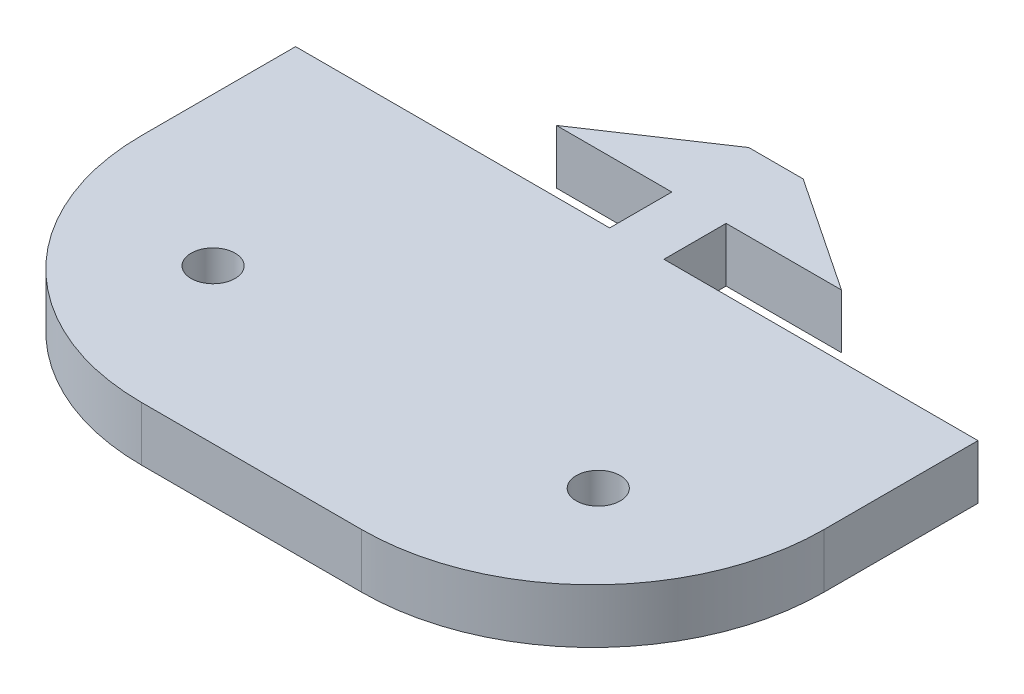
ISO-10303-21;
HEADER;
FILE_DESCRIPTION(('STEP AP214'),'2;1');
FILE_NAME('part.step','',(''),(''),'','','');
FILE_SCHEMA(('AUTOMOTIVE_DESIGN { 1 0 10303 214 1 1 1 1 }'));
ENDSEC;
DATA;
#1=APPLICATION_CONTEXT('core data for automotive mechanical design processes');
#2=APPLICATION_PROTOCOL_DEFINITION('international standard','automotive_design',2000,#1);
#3=PRODUCT_CONTEXT('',#1,'mechanical');
#4=PRODUCT('Part','Part','',(#3));
#5=PRODUCT_RELATED_PRODUCT_CATEGORY('part','',(#4));
#6=PRODUCT_DEFINITION_FORMATION('','',#4);
#7=PRODUCT_DEFINITION_CONTEXT('part definition',#1,'design');
#8=PRODUCT_DEFINITION('design','',#6,#7);
#9=PRODUCT_DEFINITION_SHAPE('','',#8);
#10=(LENGTH_UNIT() NAMED_UNIT(*) SI_UNIT(.MILLI.,.METRE.));
#11=(NAMED_UNIT(*) PLANE_ANGLE_UNIT() SI_UNIT($,.RADIAN.));
#12=(NAMED_UNIT(*) SI_UNIT($,.STERADIAN.) SOLID_ANGLE_UNIT());
#13=UNCERTAINTY_MEASURE_WITH_UNIT(LENGTH_MEASURE(1.E-05),#10,'distance_accuracy_value','');
#14=(GEOMETRIC_REPRESENTATION_CONTEXT(3) GLOBAL_UNCERTAINTY_ASSIGNED_CONTEXT((#13)) GLOBAL_UNIT_ASSIGNED_CONTEXT((#10,
#11,#12)) REPRESENTATION_CONTEXT('',''));
#15=CARTESIAN_POINT('',(0.,0.,0.));
#16=DIRECTION('',(0.,0.,1.));
#17=DIRECTION('',(1.,0.,0.));
#18=AXIS2_PLACEMENT_3D('',#15,#16,#17);
#19=CARTESIAN_POINT('',(0.,3.5814,27.45));
#20=DIRECTION('',(0.,0.,-1.));
#21=DIRECTION('',(-1.,0.,0.));
#22=AXIS2_PLACEMENT_3D('',#19,#20,#21);
#23=PLANE('',#22);
#24=DIRECTION('',(1.,0.,0.));
#25=VECTOR('',#24,1.);
#26=CARTESIAN_POINT('',(0.,3.5814,27.45));
#27=LINE('',#26,#25);
#28=CARTESIAN_POINT('',(-7.26,3.5814,27.45));
#29=VERTEX_POINT('',#28);
#30=CARTESIAN_POINT('',(7.25999999999999,3.5814,27.45));
#31=VERTEX_POINT('',#30);
#32=EDGE_CURVE('E144',#29,#31,#27,.T.);
#33=ORIENTED_EDGE('',*,*,#32,.F.);
#34=DIRECTION('',(0.,-1.,0.));
#35=VECTOR('',#34,1.);
#36=CARTESIAN_POINT('',(-7.26,3.5814,27.45));
#37=LINE('',#36,#35);
#38=CARTESIAN_POINT('',(-7.26,0.,27.45));
#39=VERTEX_POINT('',#38);
#40=EDGE_CURVE('E237',#29,#39,#37,.T.);
#41=ORIENTED_EDGE('',*,*,#40,.T.);
#42=DIRECTION('',(1.,0.,0.));
#43=VECTOR('',#42,1.);
#44=CARTESIAN_POINT('',(0.,0.,27.45));
#45=LINE('',#44,#43);
#46=CARTESIAN_POINT('',(7.25999999999999,0.,27.45));
#47=VERTEX_POINT('',#46);
#48=EDGE_CURVE('E187',#39,#47,#45,.T.);
#49=ORIENTED_EDGE('',*,*,#48,.T.);
#50=DIRECTION('',(0.,-1.,0.));
#51=VECTOR('',#50,1.);
#52=CARTESIAN_POINT('',(7.25999999999999,3.5814,27.45));
#53=LINE('',#52,#51);
#54=EDGE_CURVE('E154',#47,#31,#53,.F.);
#55=ORIENTED_EDGE('',*,*,#54,.T.);
#56=EDGE_LOOP('',(#33,#41,#49,#55));
#57=FACE_BOUND('',#56,.T.);
#58=ADVANCED_FACE('F35',(#57),#23,.F.);
#59=CARTESIAN_POINT('',(22.5,3.5814,0.));
#60=DIRECTION('',(-1.,0.,0.));
#61=DIRECTION('',(0.,0.,1.));
#62=AXIS2_PLACEMENT_3D('',#59,#60,#61);
#63=PLANE('',#62);
#64=DIRECTION('',(0.,0.,-1.));
#65=VECTOR('',#64,1.);
#66=CARTESIAN_POINT('',(22.5,3.5814,0.));
#67=LINE('',#66,#65);
#68=CARTESIAN_POINT('',(22.5,3.5814,12.21));
#69=VERTEX_POINT('',#68);
#70=CARTESIAN_POINT('',(22.5,3.5814,2.05));
#71=VERTEX_POINT('',#70);
#72=EDGE_CURVE('E137',#69,#71,#67,.T.);
#73=ORIENTED_EDGE('',*,*,#72,.F.);
#74=DIRECTION('',(0.,-1.,0.));
#75=VECTOR('',#74,1.);
#76=CARTESIAN_POINT('',(22.5,3.5814,12.21));
#77=LINE('',#76,#75);
#78=CARTESIAN_POINT('',(22.5,0.,12.21));
#79=VERTEX_POINT('',#78);
#80=EDGE_CURVE('E11',#69,#79,#77,.T.);
#81=ORIENTED_EDGE('',*,*,#80,.T.);
#82=DIRECTION('',(0.,0.,-1.));
#83=VECTOR('',#82,1.);
#84=CARTESIAN_POINT('',(22.5,0.,0.));
#85=LINE('',#84,#83);
#86=CARTESIAN_POINT('',(22.5,0.,2.05));
#87=VERTEX_POINT('',#86);
#88=EDGE_CURVE('E150',#79,#87,#85,.T.);
#89=ORIENTED_EDGE('',*,*,#88,.T.);
#90=DIRECTION('',(0.,-1.,0.));
#91=VECTOR('',#90,1.);
#92=CARTESIAN_POINT('',(22.5,3.5814,2.05));
#93=LINE('',#92,#91);
#94=EDGE_CURVE('E147',#71,#87,#93,.T.);
#95=ORIENTED_EDGE('',*,*,#94,.F.);
#96=EDGE_LOOP('',(#73,#81,#89,#95));
#97=FACE_BOUND('',#96,.T.);
#98=ADVANCED_FACE('F148',(#97),#63,.F.);
#99=CARTESIAN_POINT('',(0.,3.5814,2.05));
#100=DIRECTION('',(0.,0.,-1.));
#101=DIRECTION('',(-1.,0.,0.));
#102=AXIS2_PLACEMENT_3D('',#99,#100,#101);
#103=PLANE('',#102);
#104=DIRECTION('',(1.,0.,0.));
#105=VECTOR('',#104,1.);
#106=CARTESIAN_POINT('',(0.,0.,2.05));
#107=LINE('',#106,#105);
#108=CARTESIAN_POINT('',(1.7907,0.,2.05));
#109=VERTEX_POINT('',#108);
#110=EDGE_CURVE('E192',#109,#87,#107,.T.);
#111=ORIENTED_EDGE('',*,*,#110,.F.);
#112=DIRECTION('',(0.,-1.,0.));
#113=VECTOR('',#112,1.);
#114=CARTESIAN_POINT('',(1.7907,3.5814,2.05));
#115=LINE('',#114,#113);
#116=CARTESIAN_POINT('',(1.7907,3.5814,2.05));
#117=VERTEX_POINT('',#116);
#118=EDGE_CURVE('E155',#117,#109,#115,.T.);
#119=ORIENTED_EDGE('',*,*,#118,.F.);
#120=DIRECTION('',(1.,0.,0.));
#121=VECTOR('',#120,1.);
#122=CARTESIAN_POINT('',(0.,3.5814,2.05));
#123=LINE('',#122,#121);
#124=EDGE_CURVE('E141',#117,#71,#123,.T.);
#125=ORIENTED_EDGE('',*,*,#124,.T.);
#126=ORIENTED_EDGE('',*,*,#94,.T.);
#127=EDGE_LOOP('',(#111,#119,#125,#126));
#128=FACE_BOUND('',#127,.T.);
#129=ADVANCED_FACE('F157',(#128),#103,.T.);
#130=CARTESIAN_POINT('',(1.7907,3.5814,0.));
#131=DIRECTION('',(-1.,0.,0.));
#132=DIRECTION('',(0.,0.,1.));
#133=AXIS2_PLACEMENT_3D('',#130,#131,#132);
#134=PLANE('',#133);
#135=DIRECTION('',(0.,0.,-1.));
#136=VECTOR('',#135,1.);
#137=CARTESIAN_POINT('',(1.7907,0.,0.));
#138=LINE('',#137,#136);
#139=CARTESIAN_POINT('',(1.7907,0.,-2.05));
#140=VERTEX_POINT('',#139);
#141=EDGE_CURVE('E194',#109,#140,#138,.T.);
#142=ORIENTED_EDGE('',*,*,#141,.T.);
#143=DIRECTION('',(0.,-1.,0.));
#144=VECTOR('',#143,1.);
#145=CARTESIAN_POINT('',(1.7907,3.5814,-2.05));
#146=LINE('',#145,#144);
#147=CARTESIAN_POINT('',(1.7907,3.5814,-2.05));
#148=VERTEX_POINT('',#147);
#149=EDGE_CURVE('E233',#148,#140,#146,.T.);
#150=ORIENTED_EDGE('',*,*,#149,.F.);
#151=DIRECTION('',(0.,0.,-1.));
#152=VECTOR('',#151,1.);
#153=CARTESIAN_POINT('',(1.7907,3.5814,0.));
#154=LINE('',#153,#152);
#155=EDGE_CURVE('E159',#117,#148,#154,.T.);
#156=ORIENTED_EDGE('',*,*,#155,.F.);
#157=ORIENTED_EDGE('',*,*,#118,.T.);
#158=EDGE_LOOP('',(#142,#150,#156,#157));
#159=FACE_BOUND('',#158,.T.);
#160=ADVANCED_FACE('F289',(#159),#134,.F.);
#161=CARTESIAN_POINT('',(0.,3.5814,-2.05));
#162=DIRECTION('',(0.,0.,1.));
#163=DIRECTION('',(1.,0.,0.));
#164=AXIS2_PLACEMENT_3D('',#161,#162,#163);
#165=PLANE('',#164);
#166=DIRECTION('',(-1.,0.,0.));
#167=VECTOR('',#166,1.);
#168=CARTESIAN_POINT('',(0.,0.,-2.05));
#169=LINE('',#168,#167);
#170=CARTESIAN_POINT('',(9.398,0.,-2.05));
#171=VERTEX_POINT('',#170);
#172=EDGE_CURVE('E197',#171,#140,#169,.T.);
#173=ORIENTED_EDGE('',*,*,#172,.F.);
#174=DIRECTION('',(0.,-1.,0.));
#175=VECTOR('',#174,1.);
#176=CARTESIAN_POINT('',(9.398,3.5814,-2.05));
#177=LINE('',#176,#175);
#178=CARTESIAN_POINT('',(9.398,3.5814,-2.05));
#179=VERTEX_POINT('',#178);
#180=EDGE_CURVE('E231',#179,#171,#177,.T.);
#181=ORIENTED_EDGE('',*,*,#180,.F.);
#182=DIRECTION('',(-1.,0.,0.));
#183=VECTOR('',#182,1.);
#184=CARTESIAN_POINT('',(0.,3.5814,-2.05));
#185=LINE('',#184,#183);
#186=EDGE_CURVE('E161',#179,#148,#185,.T.);
#187=ORIENTED_EDGE('',*,*,#186,.T.);
#188=ORIENTED_EDGE('',*,*,#149,.T.);
#189=EDGE_LOOP('',(#173,#181,#187,#188));
#190=FACE_BOUND('',#189,.T.);
#191=ADVANCED_FACE('F285',(#190),#165,.T.);
#192=CARTESIAN_POINT('',(3.84513522525978,3.5814,-5.75808999982652));
#193=DIRECTION('',(0.555340809590661,0.,-0.831622862362014));
#194=DIRECTION('',(-0.831622862362014,0.,-0.555340809590661));
#195=AXIS2_PLACEMENT_3D('',#192,#193,#194);
#196=PLANE('',#195);
#197=DIRECTION('',(0.831622862362014,0.,0.555340809590661));
#198=VECTOR('',#197,1.);
#199=CARTESIAN_POINT('',(3.84513522525978,0.,-5.75808999982652));
#200=LINE('',#199,#198);
#201=CARTESIAN_POINT('',(1.7907,0.,-7.13));
#202=VERTEX_POINT('',#201);
#203=EDGE_CURVE('E200',#202,#171,#200,.T.);
#204=ORIENTED_EDGE('',*,*,#203,.F.);
#205=DIRECTION('',(0.,-1.,0.));
#206=VECTOR('',#205,1.);
#207=CARTESIAN_POINT('',(1.7907,3.5814,-7.13));
#208=LINE('',#207,#206);
#209=CARTESIAN_POINT('',(1.7907,3.5814,-7.13));
#210=VERTEX_POINT('',#209);
#211=EDGE_CURVE('E229',#210,#202,#208,.T.);
#212=ORIENTED_EDGE('',*,*,#211,.F.);
#213=DIRECTION('',(0.831622862362014,0.,0.555340809590661));
#214=VECTOR('',#213,1.);
#215=CARTESIAN_POINT('',(3.84513522525978,3.5814,-5.75808999982652));
#216=LINE('',#215,#214);
#217=EDGE_CURVE('E167',#210,#179,#216,.T.);
#218=ORIENTED_EDGE('',*,*,#217,.T.);
#219=ORIENTED_EDGE('',*,*,#180,.T.);
#220=EDGE_LOOP('',(#204,#212,#218,#219));
#221=FACE_BOUND('',#220,.T.);
#222=ADVANCED_FACE('F281',(#221),#196,.T.);
#223=CARTESIAN_POINT('',(0.,3.5814,-7.13));
#224=DIRECTION('',(0.,0.,-1.));
#225=DIRECTION('',(-1.,0.,0.));
#226=AXIS2_PLACEMENT_3D('',#223,#224,#225);
#227=PLANE('',#226);
#228=DIRECTION('',(1.,0.,0.));
#229=VECTOR('',#228,1.);
#230=CARTESIAN_POINT('',(0.,0.,-7.13));
#231=LINE('',#230,#229);
#232=CARTESIAN_POINT('',(-1.7907,0.,-7.13));
#233=VERTEX_POINT('',#232);
#234=EDGE_CURVE('E203',#233,#202,#231,.T.);
#235=ORIENTED_EDGE('',*,*,#234,.F.);
#236=DIRECTION('',(0.,-1.,0.));
#237=VECTOR('',#236,1.);
#238=CARTESIAN_POINT('',(-1.7907,3.5814,-7.13));
#239=LINE('',#238,#237);
#240=CARTESIAN_POINT('',(-1.7907,3.5814,-7.13));
#241=VERTEX_POINT('',#240);
#242=EDGE_CURVE('E227',#241,#233,#239,.T.);
#243=ORIENTED_EDGE('',*,*,#242,.F.);
#244=DIRECTION('',(1.,0.,0.));
#245=VECTOR('',#244,1.);
#246=CARTESIAN_POINT('',(0.,3.5814,-7.13));
#247=LINE('',#246,#245);
#248=EDGE_CURVE('E170',#241,#210,#247,.T.);
#249=ORIENTED_EDGE('',*,*,#248,.T.);
#250=ORIENTED_EDGE('',*,*,#211,.T.);
#251=EDGE_LOOP('',(#235,#243,#249,#250));
#252=FACE_BOUND('',#251,.T.);
#253=ADVANCED_FACE('F277',(#252),#227,.T.);
#254=CARTESIAN_POINT('',(-3.84513522525978,3.5814,-5.75808999982652));
#255=DIRECTION('',(-0.555340809590661,0.,-0.831622862362014));
#256=DIRECTION('',(-0.831622862362014,0.,0.555340809590661));
#257=AXIS2_PLACEMENT_3D('',#254,#255,#256);
#258=PLANE('',#257);
#259=DIRECTION('',(0.831622862362014,0.,-0.555340809590661));
#260=VECTOR('',#259,1.);
#261=CARTESIAN_POINT('',(-3.84513522525978,0.,-5.75808999982652));
#262=LINE('',#261,#260);
#263=CARTESIAN_POINT('',(-9.398,0.,-2.05));
#264=VERTEX_POINT('',#263);
#265=EDGE_CURVE('E206',#264,#233,#262,.T.);
#266=ORIENTED_EDGE('',*,*,#265,.F.);
#267=DIRECTION('',(0.,-1.,0.));
#268=VECTOR('',#267,1.);
#269=CARTESIAN_POINT('',(-9.398,3.5814,-2.05));
#270=LINE('',#269,#268);
#271=CARTESIAN_POINT('',(-9.398,3.5814,-2.05));
#272=VERTEX_POINT('',#271);
#273=EDGE_CURVE('E225',#272,#264,#270,.T.);
#274=ORIENTED_EDGE('',*,*,#273,.F.);
#275=DIRECTION('',(0.831622862362014,0.,-0.555340809590661));
#276=VECTOR('',#275,1.);
#277=CARTESIAN_POINT('',(-3.84513522525978,3.5814,-5.75808999982652));
#278=LINE('',#277,#276);
#279=EDGE_CURVE('E173',#272,#241,#278,.T.);
#280=ORIENTED_EDGE('',*,*,#279,.T.);
#281=ORIENTED_EDGE('',*,*,#242,.T.);
#282=EDGE_LOOP('',(#266,#274,#280,#281));
#283=FACE_BOUND('',#282,.T.);
#284=ADVANCED_FACE('F273',(#283),#258,.T.);
#285=CARTESIAN_POINT('',(0.,3.5814,-2.05));
#286=DIRECTION('',(0.,0.,1.));
#287=DIRECTION('',(1.,0.,0.));
#288=AXIS2_PLACEMENT_3D('',#285,#286,#287);
#289=PLANE('',#288);
#290=DIRECTION('',(-1.,0.,0.));
#291=VECTOR('',#290,1.);
#292=CARTESIAN_POINT('',(0.,0.,-2.05));
#293=LINE('',#292,#291);
#294=CARTESIAN_POINT('',(-1.7907,0.,-2.05));
#295=VERTEX_POINT('',#294);
#296=EDGE_CURVE('E209',#295,#264,#293,.T.);
#297=ORIENTED_EDGE('',*,*,#296,.F.);
#298=DIRECTION('',(0.,-1.,0.));
#299=VECTOR('',#298,1.);
#300=CARTESIAN_POINT('',(-1.7907,3.5814,-2.05));
#301=LINE('',#300,#299);
#302=CARTESIAN_POINT('',(-1.7907,3.5814,-2.05));
#303=VERTEX_POINT('',#302);
#304=EDGE_CURVE('E223',#303,#295,#301,.T.);
#305=ORIENTED_EDGE('',*,*,#304,.F.);
#306=DIRECTION('',(-1.,0.,0.));
#307=VECTOR('',#306,1.);
#308=CARTESIAN_POINT('',(0.,3.5814,-2.05));
#309=LINE('',#308,#307);
#310=EDGE_CURVE('E176',#303,#272,#309,.T.);
#311=ORIENTED_EDGE('',*,*,#310,.T.);
#312=ORIENTED_EDGE('',*,*,#273,.T.);
#313=EDGE_LOOP('',(#297,#305,#311,#312));
#314=FACE_BOUND('',#313,.T.);
#315=ADVANCED_FACE('F269',(#314),#289,.T.);
#316=CARTESIAN_POINT('',(-1.7907,3.5814,0.));
#317=DIRECTION('',(-1.,0.,0.));
#318=DIRECTION('',(0.,0.,1.));
#319=AXIS2_PLACEMENT_3D('',#316,#317,#318);
#320=PLANE('',#319);
#321=DIRECTION('',(0.,0.,-1.));
#322=VECTOR('',#321,1.);
#323=CARTESIAN_POINT('',(-1.7907,0.,0.));
#324=LINE('',#323,#322);
#325=CARTESIAN_POINT('',(-1.7907,0.,2.05));
#326=VERTEX_POINT('',#325);
#327=EDGE_CURVE('E212',#326,#295,#324,.T.);
#328=ORIENTED_EDGE('',*,*,#327,.F.);
#329=DIRECTION('',(0.,-1.,0.));
#330=VECTOR('',#329,1.);
#331=CARTESIAN_POINT('',(-1.7907,3.5814,2.05));
#332=LINE('',#331,#330);
#333=CARTESIAN_POINT('',(-1.7907,3.5814,2.05));
#334=VERTEX_POINT('',#333);
#335=EDGE_CURVE('E221',#334,#326,#332,.T.);
#336=ORIENTED_EDGE('',*,*,#335,.F.);
#337=DIRECTION('',(0.,0.,-1.));
#338=VECTOR('',#337,1.);
#339=CARTESIAN_POINT('',(-1.7907,3.5814,0.));
#340=LINE('',#339,#338);
#341=EDGE_CURVE('E179',#334,#303,#340,.T.);
#342=ORIENTED_EDGE('',*,*,#341,.T.);
#343=ORIENTED_EDGE('',*,*,#304,.T.);
#344=EDGE_LOOP('',(#328,#336,#342,#343));
#345=FACE_BOUND('',#344,.T.);
#346=ADVANCED_FACE('F265',(#345),#320,.T.);
#347=CARTESIAN_POINT('',(0.,3.5814,2.05));
#348=DIRECTION('',(0.,0.,1.));
#349=DIRECTION('',(1.,0.,0.));
#350=AXIS2_PLACEMENT_3D('',#347,#348,#349);
#351=PLANE('',#350);
#352=DIRECTION('',(-1.,0.,0.));
#353=VECTOR('',#352,1.);
#354=CARTESIAN_POINT('',(0.,0.,2.05));
#355=LINE('',#354,#353);
#356=CARTESIAN_POINT('',(-22.5,0.,2.05));
#357=VERTEX_POINT('',#356);
#358=EDGE_CURVE('E215',#326,#357,#355,.T.);
#359=ORIENTED_EDGE('',*,*,#358,.T.);
#360=DIRECTION('',(0.,-1.,0.));
#361=VECTOR('',#360,1.);
#362=CARTESIAN_POINT('',(-22.5,3.5814,2.05));
#363=LINE('',#362,#361);
#364=CARTESIAN_POINT('',(-22.5,3.5814,2.05));
#365=VERTEX_POINT('',#364);
#366=EDGE_CURVE('E186',#365,#357,#363,.T.);
#367=ORIENTED_EDGE('',*,*,#366,.F.);
#368=DIRECTION('',(-1.,0.,0.));
#369=VECTOR('',#368,1.);
#370=CARTESIAN_POINT('',(0.,3.5814,2.05));
#371=LINE('',#370,#369);
#372=EDGE_CURVE('E182',#334,#365,#371,.T.);
#373=ORIENTED_EDGE('',*,*,#372,.F.);
#374=ORIENTED_EDGE('',*,*,#335,.T.);
#375=EDGE_LOOP('',(#359,#367,#373,#374));
#376=FACE_BOUND('',#375,.T.);
#377=ADVANCED_FACE('F261',(#376),#351,.F.);
#378=CARTESIAN_POINT('',(-22.5,3.5814,0.));
#379=DIRECTION('',(1.,0.,0.));
#380=DIRECTION('',(0.,0.,-1.));
#381=AXIS2_PLACEMENT_3D('',#378,#379,#380);
#382=PLANE('',#381);
#383=DIRECTION('',(0.,0.,1.));
#384=VECTOR('',#383,1.);
#385=CARTESIAN_POINT('',(-22.5,0.,0.));
#386=LINE('',#385,#384);
#387=CARTESIAN_POINT('',(-22.5,0.,12.21));
#388=VERTEX_POINT('',#387);
#389=EDGE_CURVE('E217',#357,#388,#386,.T.);
#390=ORIENTED_EDGE('',*,*,#389,.T.);
#391=DIRECTION('',(0.,-1.,0.));
#392=VECTOR('',#391,1.);
#393=CARTESIAN_POINT('',(-22.5,3.5814,12.21));
#394=LINE('',#393,#392);
#395=CARTESIAN_POINT('',(-22.5,3.5814,12.21));
#396=VERTEX_POINT('',#395);
#397=EDGE_CURVE('E58',#388,#396,#394,.F.);
#398=ORIENTED_EDGE('',*,*,#397,.T.);
#399=DIRECTION('',(0.,0.,1.));
#400=VECTOR('',#399,1.);
#401=CARTESIAN_POINT('',(-22.5,3.5814,0.));
#402=LINE('',#401,#400);
#403=EDGE_CURVE('E184',#365,#396,#402,.T.);
#404=ORIENTED_EDGE('',*,*,#403,.F.);
#405=ORIENTED_EDGE('',*,*,#366,.T.);
#406=EDGE_LOOP('',(#390,#398,#404,#405));
#407=FACE_BOUND('',#406,.T.);
#408=ADVANCED_FACE('F257',(#407),#382,.F.);
#409=CARTESIAN_POINT('',(0.,3.5814,0.));
#410=DIRECTION('',(0.,1.,0.));
#411=DIRECTION('',(0.,0.,1.));
#412=AXIS2_PLACEMENT_3D('',#409,#410,#411);
#413=PLANE('',#412);
#414=CARTESIAN_POINT('',(-12.7,3.5814,17.29));
#415=DIRECTION('',(0.,1.,0.));
#416=DIRECTION('',(0.,0.,1.));
#417=AXIS2_PLACEMENT_3D('',#414,#415,#416);
#418=CIRCLE('',#417,1.45);
#419=CARTESIAN_POINT('',(-12.7,3.5814,18.74));
#420=VERTEX_POINT('',#419);
#421=EDGE_CURVE('E449',#420,#420,#418,.T.);
#422=ORIENTED_EDGE('',*,*,#421,.F.);
#423=EDGE_LOOP('',(#422));
#424=FACE_BOUND('',#423,.T.);
#425=CARTESIAN_POINT('',(12.7,3.5814,17.29));
#426=DIRECTION('',(0.,1.,0.));
#427=DIRECTION('',(0.,0.,1.));
#428=AXIS2_PLACEMENT_3D('',#425,#426,#427);
#429=CIRCLE('',#428,1.45);
#430=CARTESIAN_POINT('',(12.7,3.5814,18.74));
#431=VERTEX_POINT('',#430);
#432=EDGE_CURVE('E450',#431,#431,#429,.T.);
#433=ORIENTED_EDGE('',*,*,#432,.F.);
#434=EDGE_LOOP('',(#433));
#435=FACE_BOUND('',#434,.T.);
#436=ORIENTED_EDGE('',*,*,#403,.T.);
#437=CARTESIAN_POINT('',(-7.26,3.5814,12.21));
#438=DIRECTION('',(0.,1.,0.));
#439=DIRECTION('',(0.,0.,1.));
#440=AXIS2_PLACEMENT_3D('',#437,#438,#439);
#441=CIRCLE('',#440,15.24);
#442=EDGE_CURVE('E43',#396,#29,#441,.T.);
#443=ORIENTED_EDGE('',*,*,#442,.T.);
#444=ORIENTED_EDGE('',*,*,#32,.T.);
#445=CARTESIAN_POINT('',(7.25999999999999,3.5814,12.21));
#446=DIRECTION('',(0.,1.,0.));
#447=DIRECTION('',(0.,0.,1.));
#448=AXIS2_PLACEMENT_3D('',#445,#446,#447);
#449=CIRCLE('',#448,15.24);
#450=EDGE_CURVE('E50',#31,#69,#449,.T.);
#451=ORIENTED_EDGE('',*,*,#450,.T.);
#452=ORIENTED_EDGE('',*,*,#72,.T.);
#453=ORIENTED_EDGE('',*,*,#124,.F.);
#454=ORIENTED_EDGE('',*,*,#155,.T.);
#455=ORIENTED_EDGE('',*,*,#186,.F.);
#456=ORIENTED_EDGE('',*,*,#217,.F.);
#457=ORIENTED_EDGE('',*,*,#248,.F.);
#458=ORIENTED_EDGE('',*,*,#279,.F.);
#459=ORIENTED_EDGE('',*,*,#310,.F.);
#460=ORIENTED_EDGE('',*,*,#341,.F.);
#461=ORIENTED_EDGE('',*,*,#372,.T.);
#462=EDGE_LOOP('',(#436,#443,#444,#451,#452,#453,#454,#455,#456,#457,#458,#459,#460,#461));
#463=FACE_BOUND('',#462,.T.);
#464=ADVANCED_FACE('F139',(#424,#435,#463),#413,.T.);
#465=CARTESIAN_POINT('',(0.,0.,0.));
#466=DIRECTION('',(0.,1.,0.));
#467=DIRECTION('',(0.,0.,1.));
#468=AXIS2_PLACEMENT_3D('',#465,#466,#467);
#469=PLANE('',#468);
#470=CARTESIAN_POINT('',(-12.7,0.,17.29));
#471=DIRECTION('',(0.,1.,0.));
#472=DIRECTION('',(0.,0.,1.));
#473=AXIS2_PLACEMENT_3D('',#470,#471,#472);
#474=CIRCLE('',#473,1.45);
#475=CARTESIAN_POINT('',(-12.7,0.,18.74));
#476=VERTEX_POINT('',#475);
#477=EDGE_CURVE('E190',#476,#476,#474,.T.);
#478=ORIENTED_EDGE('',*,*,#477,.T.);
#479=EDGE_LOOP('',(#478));
#480=FACE_BOUND('',#479,.T.);
#481=CARTESIAN_POINT('',(12.7,0.,17.29));
#482=DIRECTION('',(0.,1.,0.));
#483=DIRECTION('',(0.,0.,1.));
#484=AXIS2_PLACEMENT_3D('',#481,#482,#483);
#485=CIRCLE('',#484,1.45);
#486=CARTESIAN_POINT('',(12.7,0.,18.74));
#487=VERTEX_POINT('',#486);
#488=EDGE_CURVE('E448',#487,#487,#485,.T.);
#489=ORIENTED_EDGE('',*,*,#488,.T.);
#490=EDGE_LOOP('',(#489));
#491=FACE_BOUND('',#490,.T.);
#492=ORIENTED_EDGE('',*,*,#48,.F.);
#493=CARTESIAN_POINT('',(-7.26,0.,12.21));
#494=DIRECTION('',(0.,1.,0.));
#495=DIRECTION('',(0.,0.,1.));
#496=AXIS2_PLACEMENT_3D('',#493,#494,#495);
#497=CIRCLE('',#496,15.24);
#498=EDGE_CURVE('E242',#39,#388,#497,.F.);
#499=ORIENTED_EDGE('',*,*,#498,.T.);
#500=ORIENTED_EDGE('',*,*,#389,.F.);
#501=ORIENTED_EDGE('',*,*,#358,.F.);
#502=ORIENTED_EDGE('',*,*,#327,.T.);
#503=ORIENTED_EDGE('',*,*,#296,.T.);
#504=ORIENTED_EDGE('',*,*,#265,.T.);
#505=ORIENTED_EDGE('',*,*,#234,.T.);
#506=ORIENTED_EDGE('',*,*,#203,.T.);
#507=ORIENTED_EDGE('',*,*,#172,.T.);
#508=ORIENTED_EDGE('',*,*,#141,.F.);
#509=ORIENTED_EDGE('',*,*,#110,.T.);
#510=ORIENTED_EDGE('',*,*,#88,.F.);
#511=CARTESIAN_POINT('',(7.25999999999999,0.,12.21));
#512=DIRECTION('',(0.,1.,0.));
#513=DIRECTION('',(0.,0.,1.));
#514=AXIS2_PLACEMENT_3D('',#511,#512,#513);
#515=CIRCLE('',#514,15.24);
#516=EDGE_CURVE('E240',#79,#47,#515,.F.);
#517=ORIENTED_EDGE('',*,*,#516,.T.);
#518=EDGE_LOOP('',(#492,#499,#500,#501,#502,#503,#504,#505,#506,#507,#508,#509,#510,#517));
#519=FACE_BOUND('',#518,.T.);
#520=ADVANCED_FACE('F255',(#480,#491,#519),#469,.F.);
#521=CARTESIAN_POINT('',(12.7,0.,17.29));
#522=DIRECTION('',(0.,1.,0.));
#523=DIRECTION('',(0.,0.,1.));
#524=AXIS2_PLACEMENT_3D('',#521,#522,#523);
#525=CYLINDRICAL_SURFACE('',#524,1.45);
#526=ORIENTED_EDGE('',*,*,#488,.F.);
#527=EDGE_LOOP('',(#526));
#528=FACE_BOUND('',#527,.T.);
#529=ORIENTED_EDGE('',*,*,#432,.T.);
#530=EDGE_LOOP('',(#529));
#531=FACE_BOUND('',#530,.T.);
#532=ADVANCED_FACE('F311',(#528,#531),#525,.F.);
#533=CARTESIAN_POINT('',(-12.7,0.,17.29));
#534=DIRECTION('',(0.,1.,0.));
#535=DIRECTION('',(0.,0.,1.));
#536=AXIS2_PLACEMENT_3D('',#533,#534,#535);
#537=CYLINDRICAL_SURFACE('',#536,1.45);
#538=ORIENTED_EDGE('',*,*,#477,.F.);
#539=EDGE_LOOP('',(#538));
#540=FACE_BOUND('',#539,.T.);
#541=ORIENTED_EDGE('',*,*,#421,.T.);
#542=EDGE_LOOP('',(#541));
#543=FACE_BOUND('',#542,.T.);
#544=ADVANCED_FACE('F305',(#540,#543),#537,.F.);
#545=CARTESIAN_POINT('',(-7.26,3.5814,12.21));
#546=DIRECTION('',(0.,-1.,0.));
#547=DIRECTION('',(0.,0.,-1.));
#548=AXIS2_PLACEMENT_3D('',#545,#546,#547);
#549=CYLINDRICAL_SURFACE('',#548,15.24);
#550=ORIENTED_EDGE('',*,*,#442,.F.);
#551=ORIENTED_EDGE('',*,*,#397,.F.);
#552=ORIENTED_EDGE('',*,*,#498,.F.);
#553=ORIENTED_EDGE('',*,*,#40,.F.);
#554=EDGE_LOOP('',(#550,#551,#552,#553));
#555=FACE_BOUND('',#554,.T.);
#556=ADVANCED_FACE('F252',(#555),#549,.T.);
#557=CARTESIAN_POINT('',(7.25999999999999,3.5814,12.21));
#558=DIRECTION('',(0.,-1.,0.));
#559=DIRECTION('',(0.,0.,-1.));
#560=AXIS2_PLACEMENT_3D('',#557,#558,#559);
#561=CYLINDRICAL_SURFACE('',#560,15.24);
#562=ORIENTED_EDGE('',*,*,#450,.F.);
#563=ORIENTED_EDGE('',*,*,#54,.F.);
#564=ORIENTED_EDGE('',*,*,#516,.F.);
#565=ORIENTED_EDGE('',*,*,#80,.F.);
#566=EDGE_LOOP('',(#562,#563,#564,#565));
#567=FACE_BOUND('',#566,.T.);
#568=ADVANCED_FACE('F37',(#567),#561,.T.);
#569=CLOSED_SHELL('',(#58,#98,#129,#160,#191,#222,#253,#284,#315,#346,#377,#408,#464,#520,#532,
#544,#556,#568));
#570=MANIFOLD_SOLID_BREP('B2',#569);
#571=ADVANCED_BREP_SHAPE_REPRESENTATION('',(#18,#570),#14);
#572=SHAPE_DEFINITION_REPRESENTATION(#9,#571);
ENDSEC;
END-ISO-10303-21;
